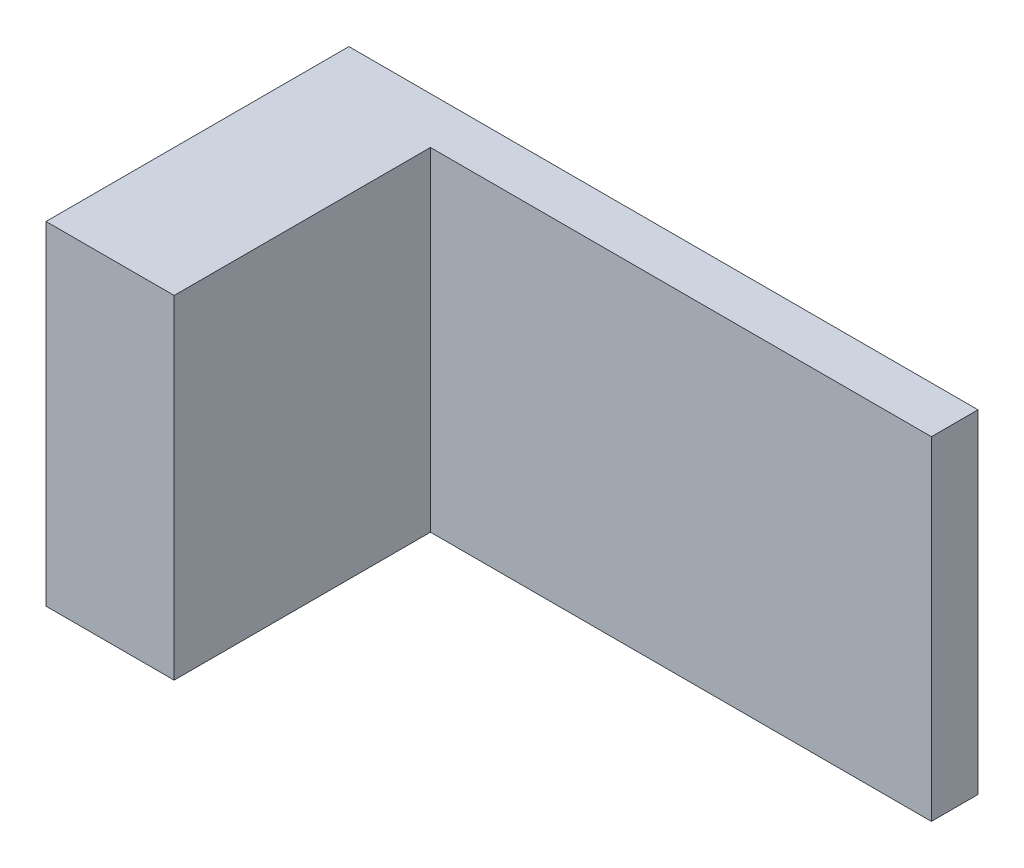
ISO-10303-21;
HEADER;
FILE_DESCRIPTION(('STEP AP214'),'2;1');
FILE_NAME('part.step','',(''),(''),'','','');
FILE_SCHEMA(('AUTOMOTIVE_DESIGN { 1 0 10303 214 1 1 1 1 }'));
ENDSEC;
DATA;
#1=APPLICATION_CONTEXT('core data for automotive mechanical design processes');
#2=APPLICATION_PROTOCOL_DEFINITION('international standard','automotive_design',2000,#1);
#3=PRODUCT_CONTEXT('',#1,'mechanical');
#4=PRODUCT('Part','Part','',(#3));
#5=PRODUCT_RELATED_PRODUCT_CATEGORY('part','',(#4));
#6=PRODUCT_DEFINITION_FORMATION('','',#4);
#7=PRODUCT_DEFINITION_CONTEXT('part definition',#1,'design');
#8=PRODUCT_DEFINITION('design','',#6,#7);
#9=PRODUCT_DEFINITION_SHAPE('','',#8);
#10=(LENGTH_UNIT() NAMED_UNIT(*) SI_UNIT(.MILLI.,.METRE.));
#11=(NAMED_UNIT(*) PLANE_ANGLE_UNIT() SI_UNIT($,.RADIAN.));
#12=(NAMED_UNIT(*) SI_UNIT($,.STERADIAN.) SOLID_ANGLE_UNIT());
#13=UNCERTAINTY_MEASURE_WITH_UNIT(LENGTH_MEASURE(1.E-05),#10,'distance_accuracy_value','');
#14=(GEOMETRIC_REPRESENTATION_CONTEXT(3) GLOBAL_UNCERTAINTY_ASSIGNED_CONTEXT((#13)) GLOBAL_UNIT_ASSIGNED_CONTEXT((#10,
#11,#12)) REPRESENTATION_CONTEXT('',''));
#15=CARTESIAN_POINT('',(0.,0.,0.));
#16=DIRECTION('',(0.,0.,1.));
#17=DIRECTION('',(1.,0.,0.));
#18=AXIS2_PLACEMENT_3D('',#15,#16,#17);
#19=CARTESIAN_POINT('',(0.,0.,0.));
#20=DIRECTION('',(0.,0.,1.));
#21=DIRECTION('',(1.,0.,0.));
#22=AXIS2_PLACEMENT_3D('',#19,#20,#21);
#23=PLANE('',#22);
#24=DIRECTION('',(0.,1.,0.));
#25=VECTOR('',#24,1.);
#26=CARTESIAN_POINT('',(13.5,7.15,0.));
#27=LINE('',#26,#25);
#28=CARTESIAN_POINT('',(13.5,-7.15,0.));
#29=VERTEX_POINT('',#28);
#30=CARTESIAN_POINT('',(13.5,7.15,0.));
#31=VERTEX_POINT('',#30);
#32=EDGE_CURVE('E154',#29,#31,#27,.T.);
#33=ORIENTED_EDGE('',*,*,#32,.F.);
#34=DIRECTION('',(1.,0.,0.));
#35=VECTOR('',#34,1.);
#36=CARTESIAN_POINT('',(-13.5,-7.15,0.));
#37=LINE('',#36,#35);
#38=CARTESIAN_POINT('',(-13.5,-7.15,0.));
#39=VERTEX_POINT('',#38);
#40=EDGE_CURVE('E159',#39,#29,#37,.T.);
#41=ORIENTED_EDGE('',*,*,#40,.F.);
#42=DIRECTION('',(0.,-1.,0.));
#43=VECTOR('',#42,1.);
#44=CARTESIAN_POINT('',(-13.5,7.15,0.));
#45=LINE('',#44,#43);
#46=CARTESIAN_POINT('',(-13.5,7.15,0.));
#47=VERTEX_POINT('',#46);
#48=EDGE_CURVE('E168',#47,#39,#45,.T.);
#49=ORIENTED_EDGE('',*,*,#48,.F.);
#50=DIRECTION('',(-1.,0.,0.));
#51=VECTOR('',#50,1.);
#52=CARTESIAN_POINT('',(-13.5,7.15,0.));
#53=LINE('',#52,#51);
#54=EDGE_CURVE('E166',#31,#47,#53,.T.);
#55=ORIENTED_EDGE('',*,*,#54,.F.);
#56=EDGE_LOOP('',(#33,#41,#49,#55));
#57=FACE_BOUND('',#56,.T.);
#58=DIRECTION('',(0.,-1.,0.));
#59=VECTOR('',#58,1.);
#60=CARTESIAN_POINT('',(9.4,-2.35,0.));
#61=LINE('',#60,#59);
#62=CARTESIAN_POINT('',(9.4,2.35,0.));
#63=VERTEX_POINT('',#62);
#64=CARTESIAN_POINT('',(9.4,-2.35,0.));
#65=VERTEX_POINT('',#64);
#66=EDGE_CURVE('E129',#63,#65,#61,.T.);
#67=ORIENTED_EDGE('',*,*,#66,.F.);
#68=DIRECTION('',(1.,0.,0.));
#69=VECTOR('',#68,1.);
#70=CARTESIAN_POINT('',(6.9,2.35,0.));
#71=LINE('',#70,#69);
#72=CARTESIAN_POINT('',(6.9,2.35,0.));
#73=VERTEX_POINT('',#72);
#74=EDGE_CURVE('E126',#73,#63,#71,.T.);
#75=ORIENTED_EDGE('',*,*,#74,.F.);
#76=DIRECTION('',(0.,1.,0.));
#77=VECTOR('',#76,1.);
#78=CARTESIAN_POINT('',(6.9,-2.35,0.));
#79=LINE('',#78,#77);
#80=CARTESIAN_POINT('',(6.9,-2.35,0.));
#81=VERTEX_POINT('',#80);
#82=EDGE_CURVE('E52',#81,#73,#79,.T.);
#83=ORIENTED_EDGE('',*,*,#82,.F.);
#84=DIRECTION('',(-1.,0.,0.));
#85=VECTOR('',#84,1.);
#86=CARTESIAN_POINT('',(6.9,-2.35,0.));
#87=LINE('',#86,#85);
#88=EDGE_CURVE('E47',#65,#81,#87,.T.);
#89=ORIENTED_EDGE('',*,*,#88,.F.);
#90=EDGE_LOOP('',(#67,#75,#83,#89));
#91=FACE_BOUND('',#90,.T.);
#92=ADVANCED_FACE('F32',(#57,#91),#23,.F.);
#93=CARTESIAN_POINT('',(13.5,7.15,2.));
#94=DIRECTION('',(-1.,0.,0.));
#95=DIRECTION('',(0.,-1.,0.));
#96=AXIS2_PLACEMENT_3D('',#93,#94,#95);
#97=PLANE('',#96);
#98=ORIENTED_EDGE('',*,*,#32,.T.);
#99=DIRECTION('',(0.,0.,-1.));
#100=VECTOR('',#99,1.);
#101=CARTESIAN_POINT('',(13.5,7.15,2.));
#102=LINE('',#101,#100);
#103=CARTESIAN_POINT('',(13.5,7.15,2.));
#104=VERTEX_POINT('',#103);
#105=EDGE_CURVE('E11',#104,#31,#102,.T.);
#106=ORIENTED_EDGE('',*,*,#105,.F.);
#107=DIRECTION('',(0.,1.,0.));
#108=VECTOR('',#107,1.);
#109=CARTESIAN_POINT('',(13.5,7.15,2.));
#110=LINE('',#109,#108);
#111=CARTESIAN_POINT('',(13.5,-7.15,2.));
#112=VERTEX_POINT('',#111);
#113=EDGE_CURVE('E155',#112,#104,#110,.T.);
#114=ORIENTED_EDGE('',*,*,#113,.F.);
#115=DIRECTION('',(0.,0.,-1.));
#116=VECTOR('',#115,1.);
#117=CARTESIAN_POINT('',(13.5,-7.15,2.));
#118=LINE('',#117,#116);
#119=EDGE_CURVE('E163',#112,#29,#118,.T.);
#120=ORIENTED_EDGE('',*,*,#119,.T.);
#121=EDGE_LOOP('',(#98,#106,#114,#120));
#122=FACE_BOUND('',#121,.T.);
#123=ADVANCED_FACE('F34',(#122),#97,.F.);
#124=CARTESIAN_POINT('',(-13.5,7.15,2.));
#125=DIRECTION('',(0.,-1.,0.));
#126=DIRECTION('',(0.,0.,-1.));
#127=AXIS2_PLACEMENT_3D('',#124,#125,#126);
#128=PLANE('',#127);
#129=ORIENTED_EDGE('',*,*,#54,.T.);
#130=DIRECTION('',(0.,0.,-1.));
#131=VECTOR('',#130,1.);
#132=CARTESIAN_POINT('',(-13.5,7.15,2.));
#133=LINE('',#132,#131);
#134=CARTESIAN_POINT('',(-13.5,7.15,13.));
#135=VERTEX_POINT('',#134);
#136=EDGE_CURVE('E40',#135,#47,#133,.T.);
#137=ORIENTED_EDGE('',*,*,#136,.F.);
#138=DIRECTION('',(-1.,0.,0.));
#139=VECTOR('',#138,1.);
#140=CARTESIAN_POINT('',(-8.,7.15,13.));
#141=LINE('',#140,#139);
#142=CARTESIAN_POINT('',(-8.,7.15,13.));
#143=VERTEX_POINT('',#142);
#144=EDGE_CURVE('E133',#143,#135,#141,.T.);
#145=ORIENTED_EDGE('',*,*,#144,.F.);
#146=DIRECTION('',(0.,0.,-1.));
#147=VECTOR('',#146,1.);
#148=CARTESIAN_POINT('',(-8.,7.15,13.));
#149=LINE('',#148,#147);
#150=CARTESIAN_POINT('',(-8.,7.15,2.));
#151=VERTEX_POINT('',#150);
#152=EDGE_CURVE('E147',#143,#151,#149,.T.);
#153=ORIENTED_EDGE('',*,*,#152,.T.);
#154=DIRECTION('',(-1.,0.,0.));
#155=VECTOR('',#154,1.);
#156=CARTESIAN_POINT('',(-13.5,7.15,2.));
#157=LINE('',#156,#155);
#158=EDGE_CURVE('E158',#104,#151,#157,.T.);
#159=ORIENTED_EDGE('',*,*,#158,.F.);
#160=ORIENTED_EDGE('',*,*,#105,.T.);
#161=EDGE_LOOP('',(#129,#137,#145,#153,#159,#160));
#162=FACE_BOUND('',#161,.T.);
#163=ADVANCED_FACE('F202',(#162),#128,.F.);
#164=CARTESIAN_POINT('',(-13.5,7.15,2.));
#165=DIRECTION('',(1.,0.,0.));
#166=DIRECTION('',(0.,1.,0.));
#167=AXIS2_PLACEMENT_3D('',#164,#165,#166);
#168=PLANE('',#167);
#169=ORIENTED_EDGE('',*,*,#48,.T.);
#170=DIRECTION('',(0.,0.,-1.));
#171=VECTOR('',#170,1.);
#172=CARTESIAN_POINT('',(-13.5,-7.15,2.));
#173=LINE('',#172,#171);
#174=CARTESIAN_POINT('',(-13.5,-7.15,13.));
#175=VERTEX_POINT('',#174);
#176=EDGE_CURVE('E173',#175,#39,#173,.T.);
#177=ORIENTED_EDGE('',*,*,#176,.F.);
#178=DIRECTION('',(0.,-1.,0.));
#179=VECTOR('',#178,1.);
#180=CARTESIAN_POINT('',(-13.5,7.15,13.));
#181=LINE('',#180,#179);
#182=EDGE_CURVE('E141',#135,#175,#181,.T.);
#183=ORIENTED_EDGE('',*,*,#182,.F.);
#184=ORIENTED_EDGE('',*,*,#136,.T.);
#185=EDGE_LOOP('',(#169,#177,#183,#184));
#186=FACE_BOUND('',#185,.T.);
#187=ADVANCED_FACE('F179',(#186),#168,.F.);
#188=CARTESIAN_POINT('',(-13.5,-7.15,2.));
#189=DIRECTION('',(0.,1.,0.));
#190=DIRECTION('',(0.,0.,1.));
#191=AXIS2_PLACEMENT_3D('',#188,#189,#190);
#192=PLANE('',#191);
#193=ORIENTED_EDGE('',*,*,#40,.T.);
#194=ORIENTED_EDGE('',*,*,#119,.F.);
#195=DIRECTION('',(1.,0.,0.));
#196=VECTOR('',#195,1.);
#197=CARTESIAN_POINT('',(-13.5,-7.15,2.));
#198=LINE('',#197,#196);
#199=CARTESIAN_POINT('',(-8.,-7.15,2.));
#200=VERTEX_POINT('',#199);
#201=EDGE_CURVE('E161',#200,#112,#198,.T.);
#202=ORIENTED_EDGE('',*,*,#201,.F.);
#203=DIRECTION('',(0.,0.,-1.));
#204=VECTOR('',#203,1.);
#205=CARTESIAN_POINT('',(-8.,-7.15,13.));
#206=LINE('',#205,#204);
#207=CARTESIAN_POINT('',(-8.,-7.15,13.));
#208=VERTEX_POINT('',#207);
#209=EDGE_CURVE('E151',#208,#200,#206,.T.);
#210=ORIENTED_EDGE('',*,*,#209,.F.);
#211=DIRECTION('',(1.,0.,0.));
#212=VECTOR('',#211,1.);
#213=CARTESIAN_POINT('',(-13.5,-7.15,13.));
#214=LINE('',#213,#212);
#215=EDGE_CURVE('E144',#175,#208,#214,.T.);
#216=ORIENTED_EDGE('',*,*,#215,.F.);
#217=ORIENTED_EDGE('',*,*,#176,.T.);
#218=EDGE_LOOP('',(#193,#194,#202,#210,#216,#217));
#219=FACE_BOUND('',#218,.T.);
#220=ADVANCED_FACE('F187',(#219),#192,.F.);
#221=CARTESIAN_POINT('',(0.,0.,2.));
#222=DIRECTION('',(0.,0.,1.));
#223=DIRECTION('',(1.,0.,0.));
#224=AXIS2_PLACEMENT_3D('',#221,#222,#223);
#225=PLANE('',#224);
#226=DIRECTION('',(0.,1.,0.));
#227=VECTOR('',#226,1.);
#228=CARTESIAN_POINT('',(-8.,7.15,2.));
#229=LINE('',#228,#227);
#230=EDGE_CURVE('E130',#200,#151,#229,.T.);
#231=ORIENTED_EDGE('',*,*,#230,.F.);
#232=ORIENTED_EDGE('',*,*,#201,.T.);
#233=ORIENTED_EDGE('',*,*,#113,.T.);
#234=ORIENTED_EDGE('',*,*,#158,.T.);
#235=EDGE_LOOP('',(#231,#232,#233,#234));
#236=FACE_BOUND('',#235,.T.);
#237=ADVANCED_FACE('F194',(#236),#225,.T.);
#238=CARTESIAN_POINT('',(-8.,7.15,13.));
#239=DIRECTION('',(-1.,0.,0.));
#240=DIRECTION('',(0.,0.,1.));
#241=AXIS2_PLACEMENT_3D('',#238,#239,#240);
#242=PLANE('',#241);
#243=ORIENTED_EDGE('',*,*,#230,.T.);
#244=ORIENTED_EDGE('',*,*,#152,.F.);
#245=DIRECTION('',(0.,1.,0.));
#246=VECTOR('',#245,1.);
#247=CARTESIAN_POINT('',(-8.,7.15,13.));
#248=LINE('',#247,#246);
#249=EDGE_CURVE('E146',#208,#143,#248,.T.);
#250=ORIENTED_EDGE('',*,*,#249,.F.);
#251=ORIENTED_EDGE('',*,*,#209,.T.);
#252=EDGE_LOOP('',(#243,#244,#250,#251));
#253=FACE_BOUND('',#252,.T.);
#254=ADVANCED_FACE('F198',(#253),#242,.F.);
#255=CARTESIAN_POINT('',(0.,0.,13.));
#256=DIRECTION('',(0.,0.,1.));
#257=DIRECTION('',(1.,0.,0.));
#258=AXIS2_PLACEMENT_3D('',#255,#256,#257);
#259=PLANE('',#258);
#260=ORIENTED_EDGE('',*,*,#144,.T.);
#261=ORIENTED_EDGE('',*,*,#182,.T.);
#262=ORIENTED_EDGE('',*,*,#215,.T.);
#263=ORIENTED_EDGE('',*,*,#249,.T.);
#264=EDGE_LOOP('',(#260,#261,#262,#263));
#265=FACE_BOUND('',#264,.T.);
#266=ADVANCED_FACE('F201',(#265),#259,.T.);
#267=CARTESIAN_POINT('',(9.4,-2.35,-1.));
#268=DIRECTION('',(-1.,0.,0.));
#269=DIRECTION('',(0.,0.,1.));
#270=AXIS2_PLACEMENT_3D('',#267,#268,#269);
#271=PLANE('',#270);
#272=ORIENTED_EDGE('',*,*,#66,.T.);
#273=DIRECTION('',(0.,0.,1.));
#274=VECTOR('',#273,1.);
#275=CARTESIAN_POINT('',(9.4,-2.35,-1.));
#276=LINE('',#275,#274);
#277=CARTESIAN_POINT('',(9.4,-2.35,-1.));
#278=VERTEX_POINT('',#277);
#279=EDGE_CURVE('E110',#278,#65,#276,.T.);
#280=ORIENTED_EDGE('',*,*,#279,.F.);
#281=DIRECTION('',(0.,-1.,0.));
#282=VECTOR('',#281,1.);
#283=CARTESIAN_POINT('',(9.4,-2.35,-1.));
#284=LINE('',#283,#282);
#285=CARTESIAN_POINT('',(9.4,2.35,-1.));
#286=VERTEX_POINT('',#285);
#287=EDGE_CURVE('E117',#286,#278,#284,.T.);
#288=ORIENTED_EDGE('',*,*,#287,.F.);
#289=DIRECTION('',(0.,0.,1.));
#290=VECTOR('',#289,1.);
#291=CARTESIAN_POINT('',(9.4,2.35,-1.));
#292=LINE('',#291,#290);
#293=EDGE_CURVE('E320',#286,#63,#292,.T.);
#294=ORIENTED_EDGE('',*,*,#293,.T.);
#295=EDGE_LOOP('',(#272,#280,#288,#294));
#296=FACE_BOUND('',#295,.T.);
#297=ADVANCED_FACE('F128',(#296),#271,.F.);
#298=CARTESIAN_POINT('',(6.9,-2.35,-1.));
#299=DIRECTION('',(0.,1.,0.));
#300=DIRECTION('',(-1.,0.,0.));
#301=AXIS2_PLACEMENT_3D('',#298,#299,#300);
#302=PLANE('',#301);
#303=ORIENTED_EDGE('',*,*,#88,.T.);
#304=DIRECTION('',(0.,0.,1.));
#305=VECTOR('',#304,1.);
#306=CARTESIAN_POINT('',(6.9,-2.35,-1.));
#307=LINE('',#306,#305);
#308=CARTESIAN_POINT('',(6.9,-2.35,-1.));
#309=VERTEX_POINT('',#308);
#310=EDGE_CURVE('E113',#309,#81,#307,.T.);
#311=ORIENTED_EDGE('',*,*,#310,.F.);
#312=DIRECTION('',(-1.,0.,0.));
#313=VECTOR('',#312,1.);
#314=CARTESIAN_POINT('',(6.9,-2.35,-1.));
#315=LINE('',#314,#313);
#316=EDGE_CURVE('E106',#278,#309,#315,.T.);
#317=ORIENTED_EDGE('',*,*,#316,.F.);
#318=ORIENTED_EDGE('',*,*,#279,.T.);
#319=EDGE_LOOP('',(#303,#311,#317,#318));
#320=FACE_BOUND('',#319,.T.);
#321=ADVANCED_FACE('F108',(#320),#302,.F.);
#322=CARTESIAN_POINT('',(6.9,-2.35,-1.));
#323=DIRECTION('',(1.,0.,0.));
#324=DIRECTION('',(0.,0.,-1.));
#325=AXIS2_PLACEMENT_3D('',#322,#323,#324);
#326=PLANE('',#325);
#327=ORIENTED_EDGE('',*,*,#82,.T.);
#328=DIRECTION('',(0.,0.,1.));
#329=VECTOR('',#328,1.);
#330=CARTESIAN_POINT('',(6.9,2.35,-1.));
#331=LINE('',#330,#329);
#332=CARTESIAN_POINT('',(6.9,2.35,-1.));
#333=VERTEX_POINT('',#332);
#334=EDGE_CURVE('E135',#333,#73,#331,.T.);
#335=ORIENTED_EDGE('',*,*,#334,.F.);
#336=DIRECTION('',(0.,1.,0.));
#337=VECTOR('',#336,1.);
#338=CARTESIAN_POINT('',(6.9,-2.35,-1.));
#339=LINE('',#338,#337);
#340=EDGE_CURVE('E116',#309,#333,#339,.T.);
#341=ORIENTED_EDGE('',*,*,#340,.F.);
#342=ORIENTED_EDGE('',*,*,#310,.T.);
#343=EDGE_LOOP('',(#327,#335,#341,#342));
#344=FACE_BOUND('',#343,.T.);
#345=ADVANCED_FACE('F234',(#344),#326,.F.);
#346=CARTESIAN_POINT('',(6.9,2.35,-1.));
#347=DIRECTION('',(0.,-1.,0.));
#348=DIRECTION('',(1.,0.,0.));
#349=AXIS2_PLACEMENT_3D('',#346,#347,#348);
#350=PLANE('',#349);
#351=ORIENTED_EDGE('',*,*,#74,.T.);
#352=ORIENTED_EDGE('',*,*,#293,.F.);
#353=DIRECTION('',(1.,0.,0.));
#354=VECTOR('',#353,1.);
#355=CARTESIAN_POINT('',(6.9,2.35,-1.));
#356=LINE('',#355,#354);
#357=EDGE_CURVE('E122',#333,#286,#356,.T.);
#358=ORIENTED_EDGE('',*,*,#357,.F.);
#359=ORIENTED_EDGE('',*,*,#334,.T.);
#360=EDGE_LOOP('',(#351,#352,#358,#359));
#361=FACE_BOUND('',#360,.T.);
#362=ADVANCED_FACE('F237',(#361),#350,.F.);
#363=CARTESIAN_POINT('',(0.,0.,-1.));
#364=DIRECTION('',(0.,0.,-1.));
#365=DIRECTION('',(-1.,0.,0.));
#366=AXIS2_PLACEMENT_3D('',#363,#364,#365);
#367=PLANE('',#366);
#368=ORIENTED_EDGE('',*,*,#287,.T.);
#369=ORIENTED_EDGE('',*,*,#316,.T.);
#370=ORIENTED_EDGE('',*,*,#340,.T.);
#371=ORIENTED_EDGE('',*,*,#357,.T.);
#372=EDGE_LOOP('',(#368,#369,#370,#371));
#373=FACE_BOUND('',#372,.T.);
#374=ADVANCED_FACE('F120',(#373),#367,.T.);
#375=CLOSED_SHELL('',(#92,#123,#163,#187,#220,#237,#254,#266,#297,#321,#345,#362,#374));
#376=MANIFOLD_SOLID_BREP('B2',#375);
#377=ADVANCED_BREP_SHAPE_REPRESENTATION('',(#18,#376),#14);
#378=SHAPE_DEFINITION_REPRESENTATION(#9,#377);
ENDSEC;
END-ISO-10303-21;
